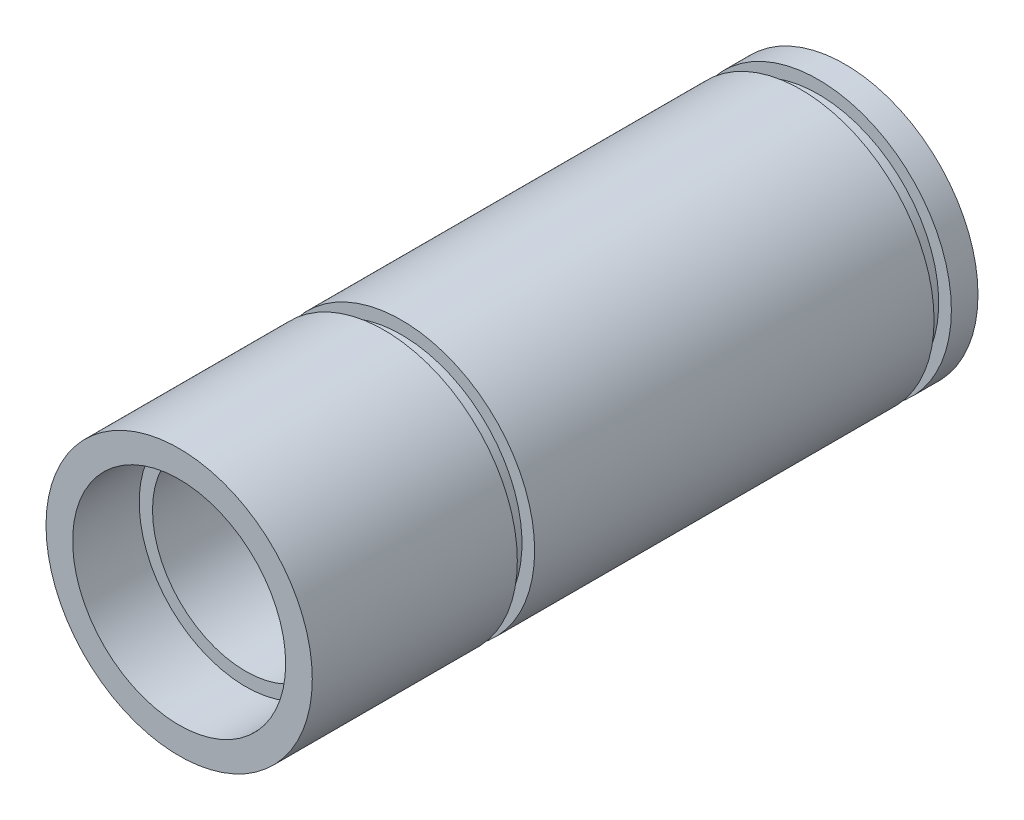
ISO-10303-21;
HEADER;
FILE_DESCRIPTION(('STEP AP214'),'2;1');
FILE_NAME('part.step','',(''),(''),'','','');
FILE_SCHEMA(('AUTOMOTIVE_DESIGN { 1 0 10303 214 1 1 1 1 }'));
ENDSEC;
DATA;
#1=APPLICATION_CONTEXT('core data for automotive mechanical design processes');
#2=APPLICATION_PROTOCOL_DEFINITION('international standard','automotive_design',2000,#1);
#3=PRODUCT_CONTEXT('',#1,'mechanical');
#4=PRODUCT('Part','Part','',(#3));
#5=PRODUCT_RELATED_PRODUCT_CATEGORY('part','',(#4));
#6=PRODUCT_DEFINITION_FORMATION('','',#4);
#7=PRODUCT_DEFINITION_CONTEXT('part definition',#1,'design');
#8=PRODUCT_DEFINITION('design','',#6,#7);
#9=PRODUCT_DEFINITION_SHAPE('','',#8);
#10=(LENGTH_UNIT() NAMED_UNIT(*) SI_UNIT(.MILLI.,.METRE.));
#11=(NAMED_UNIT(*) PLANE_ANGLE_UNIT() SI_UNIT($,.RADIAN.));
#12=(NAMED_UNIT(*) SI_UNIT($,.STERADIAN.) SOLID_ANGLE_UNIT());
#13=UNCERTAINTY_MEASURE_WITH_UNIT(LENGTH_MEASURE(1.E-05),#10,'distance_accuracy_value','');
#14=(GEOMETRIC_REPRESENTATION_CONTEXT(3) GLOBAL_UNCERTAINTY_ASSIGNED_CONTEXT((#13)) GLOBAL_UNIT_ASSIGNED_CONTEXT((#10,
#11,#12)) REPRESENTATION_CONTEXT('',''));
#15=CARTESIAN_POINT('',(0.,0.,0.));
#16=DIRECTION('',(0.,0.,1.));
#17=DIRECTION('',(1.,0.,0.));
#18=AXIS2_PLACEMENT_3D('',#15,#16,#17);
#19=CARTESIAN_POINT('',(0.,0.,50.));
#20=DIRECTION('',(0.,0.,-1.));
#21=DIRECTION('',(-1.,0.,0.));
#22=AXIS2_PLACEMENT_3D('',#19,#20,#21);
#23=CYLINDRICAL_SURFACE('',#22,10.);
#24=CARTESIAN_POINT('',(0.,0.,50.));
#25=DIRECTION('',(0.,0.,1.));
#26=DIRECTION('',(1.,0.,0.));
#27=AXIS2_PLACEMENT_3D('',#24,#25,#26);
#28=CIRCLE('',#27,10.);
#29=CARTESIAN_POINT('',(10.,0.,50.));
#30=VERTEX_POINT('',#29);
#31=EDGE_CURVE('E11',#30,#30,#28,.T.);
#32=ORIENTED_EDGE('',*,*,#31,.F.);
#33=EDGE_LOOP('',(#32));
#34=FACE_BOUND('',#33,.T.);
#35=CARTESIAN_POINT('',(0.,0.,34.6));
#36=DIRECTION('',(0.,0.,-1.));
#37=DIRECTION('',(-1.,0.,0.));
#38=AXIS2_PLACEMENT_3D('',#35,#36,#37);
#39=CIRCLE('',#38,10.);
#40=CARTESIAN_POINT('',(-10.,0.,34.6));
#41=VERTEX_POINT('',#40);
#42=EDGE_CURVE('E89',#41,#41,#39,.T.);
#43=ORIENTED_EDGE('',*,*,#42,.F.);
#44=EDGE_LOOP('',(#43));
#45=FACE_BOUND('',#44,.T.);
#46=ADVANCED_FACE('F46',(#34,#45),#23,.T.);
#47=CARTESIAN_POINT('',(0.,0.,33.3));
#48=DIRECTION('',(0.,0.,-1.));
#49=DIRECTION('',(-1.,0.,0.));
#50=AXIS2_PLACEMENT_3D('',#47,#48,#49);
#51=CIRCLE('',#50,10.);
#52=CARTESIAN_POINT('',(-10.,0.,33.3));
#53=VERTEX_POINT('',#52);
#54=EDGE_CURVE('E92',#53,#53,#51,.T.);
#55=ORIENTED_EDGE('',*,*,#54,.T.);
#56=EDGE_LOOP('',(#55));
#57=FACE_BOUND('',#56,.T.);
#58=CARTESIAN_POINT('',(0.,0.,3.3));
#59=DIRECTION('',(0.,0.,-1.));
#60=DIRECTION('',(-1.,0.,0.));
#61=AXIS2_PLACEMENT_3D('',#58,#59,#60);
#62=CIRCLE('',#61,9.99999999999997);
#63=CARTESIAN_POINT('',(-9.99999999999993,0.,3.3));
#64=VERTEX_POINT('',#63);
#65=EDGE_CURVE('E77',#64,#64,#62,.T.);
#66=ORIENTED_EDGE('',*,*,#65,.F.);
#67=EDGE_LOOP('',(#66));
#68=FACE_BOUND('',#67,.T.);
#69=ADVANCED_FACE('F116',(#57,#68),#23,.T.);
#70=CARTESIAN_POINT('',(0.,0.,50.));
#71=DIRECTION('',(0.,0.,-1.));
#72=DIRECTION('',(-1.,0.,0.));
#73=AXIS2_PLACEMENT_3D('',#70,#71,#72);
#74=CYLINDRICAL_SURFACE('',#73,7.);
#75=CARTESIAN_POINT('',(0.,0.,45.));
#76=DIRECTION('',(0.,0.,1.));
#77=DIRECTION('',(1.,0.,0.));
#78=AXIS2_PLACEMENT_3D('',#75,#76,#77);
#79=CIRCLE('',#78,7.);
#80=CARTESIAN_POINT('',(7.,0.,45.));
#81=VERTEX_POINT('',#80);
#82=EDGE_CURVE('E59',#81,#81,#79,.T.);
#83=ORIENTED_EDGE('',*,*,#82,.T.);
#84=EDGE_LOOP('',(#83));
#85=FACE_BOUND('',#84,.T.);
#86=CARTESIAN_POINT('',(0.,0.,5.));
#87=DIRECTION('',(0.,0.,-1.));
#88=DIRECTION('',(-1.,0.,0.));
#89=AXIS2_PLACEMENT_3D('',#86,#87,#88);
#90=CIRCLE('',#89,7.);
#91=CARTESIAN_POINT('',(-7.,0.,5.));
#92=VERTEX_POINT('',#91);
#93=EDGE_CURVE('E50',#92,#92,#90,.T.);
#94=ORIENTED_EDGE('',*,*,#93,.T.);
#95=EDGE_LOOP('',(#94));
#96=FACE_BOUND('',#95,.T.);
#97=ADVANCED_FACE('F122',(#85,#96),#74,.F.);
#98=CARTESIAN_POINT('',(0.,0.,50.));
#99=DIRECTION('',(0.,0.,1.));
#100=DIRECTION('',(1.,0.,0.));
#101=AXIS2_PLACEMENT_3D('',#98,#99,#100);
#102=PLANE('',#101);
#103=CARTESIAN_POINT('',(0.,0.,50.));
#104=DIRECTION('',(0.,0.,1.));
#105=DIRECTION('',(1.,0.,0.));
#106=AXIS2_PLACEMENT_3D('',#103,#104,#105);
#107=CIRCLE('',#106,8.);
#108=CARTESIAN_POINT('',(8.,0.,50.));
#109=VERTEX_POINT('',#108);
#110=EDGE_CURVE('E62',#109,#109,#107,.T.);
#111=ORIENTED_EDGE('',*,*,#110,.F.);
#112=EDGE_LOOP('',(#111));
#113=FACE_BOUND('',#112,.T.);
#114=ORIENTED_EDGE('',*,*,#31,.T.);
#115=EDGE_LOOP('',(#114));
#116=FACE_BOUND('',#115,.T.);
#117=ADVANCED_FACE('F137',(#113,#116),#102,.T.);
#118=CARTESIAN_POINT('',(0.,0.,0.));
#119=DIRECTION('',(0.,0.,1.));
#120=DIRECTION('',(1.,0.,0.));
#121=AXIS2_PLACEMENT_3D('',#118,#119,#120);
#122=PLANE('',#121);
#123=CARTESIAN_POINT('',(0.,0.,0.));
#124=DIRECTION('',(0.,0.,1.));
#125=DIRECTION('',(1.,0.,0.));
#126=AXIS2_PLACEMENT_3D('',#123,#124,#125);
#127=CIRCLE('',#126,8.);
#128=CARTESIAN_POINT('',(8.,0.,0.));
#129=VERTEX_POINT('',#128);
#130=EDGE_CURVE('E73',#129,#129,#127,.T.);
#131=ORIENTED_EDGE('',*,*,#130,.T.);
#132=EDGE_LOOP('',(#131));
#133=FACE_BOUND('',#132,.T.);
#134=CARTESIAN_POINT('',(0.,0.,0.));
#135=DIRECTION('',(0.,0.,1.));
#136=DIRECTION('',(1.,0.,0.));
#137=AXIS2_PLACEMENT_3D('',#134,#135,#136);
#138=CIRCLE('',#137,10.);
#139=CARTESIAN_POINT('',(10.,0.,0.));
#140=VERTEX_POINT('',#139);
#141=EDGE_CURVE('E54',#140,#140,#138,.T.);
#142=ORIENTED_EDGE('',*,*,#141,.F.);
#143=EDGE_LOOP('',(#142));
#144=FACE_BOUND('',#143,.T.);
#145=ADVANCED_FACE('F126',(#133,#144),#122,.F.);
#146=CARTESIAN_POINT('',(0.,0.,2.));
#147=DIRECTION('',(0.,0.,-1.));
#148=DIRECTION('',(-1.,0.,0.));
#149=AXIS2_PLACEMENT_3D('',#146,#147,#148);
#150=CIRCLE('',#149,9.99999999999997);
#151=CARTESIAN_POINT('',(-9.99999999999993,0.,2.));
#152=VERTEX_POINT('',#151);
#153=EDGE_CURVE('E80',#152,#152,#150,.T.);
#154=ORIENTED_EDGE('',*,*,#153,.T.);
#155=EDGE_LOOP('',(#154));
#156=FACE_BOUND('',#155,.T.);
#157=ORIENTED_EDGE('',*,*,#141,.T.);
#158=EDGE_LOOP('',(#157));
#159=FACE_BOUND('',#158,.T.);
#160=ADVANCED_FACE('F48',(#156,#159),#23,.T.);
#161=CARTESIAN_POINT('',(0.,0.,45.));
#162=DIRECTION('',(0.,0.,1.));
#163=DIRECTION('',(1.,0.,0.));
#164=AXIS2_PLACEMENT_3D('',#161,#162,#163);
#165=CYLINDRICAL_SURFACE('',#164,8.);
#166=CARTESIAN_POINT('',(0.,0.,45.));
#167=DIRECTION('',(0.,0.,1.));
#168=DIRECTION('',(1.,0.,0.));
#169=AXIS2_PLACEMENT_3D('',#166,#167,#168);
#170=CIRCLE('',#169,8.);
#171=CARTESIAN_POINT('',(8.,0.,45.));
#172=VERTEX_POINT('',#171);
#173=EDGE_CURVE('E65',#172,#172,#170,.T.);
#174=ORIENTED_EDGE('',*,*,#173,.F.);
#175=EDGE_LOOP('',(#174));
#176=FACE_BOUND('',#175,.T.);
#177=ORIENTED_EDGE('',*,*,#110,.T.);
#178=EDGE_LOOP('',(#177));
#179=FACE_BOUND('',#178,.T.);
#180=ADVANCED_FACE('F125',(#176,#179),#165,.F.);
#181=CARTESIAN_POINT('',(0.,0.,45.));
#182=DIRECTION('',(0.,0.,1.));
#183=DIRECTION('',(1.,0.,0.));
#184=AXIS2_PLACEMENT_3D('',#181,#182,#183);
#185=PLANE('',#184);
#186=ORIENTED_EDGE('',*,*,#82,.F.);
#187=EDGE_LOOP('',(#186));
#188=FACE_BOUND('',#187,.T.);
#189=ORIENTED_EDGE('',*,*,#173,.T.);
#190=EDGE_LOOP('',(#189));
#191=FACE_BOUND('',#190,.T.);
#192=ADVANCED_FACE('F133',(#188,#191),#185,.T.);
#193=CARTESIAN_POINT('',(0.,0.,5.));
#194=DIRECTION('',(0.,0.,-1.));
#195=DIRECTION('',(-1.,0.,0.));
#196=AXIS2_PLACEMENT_3D('',#193,#194,#195);
#197=CYLINDRICAL_SURFACE('',#196,8.);
#198=CARTESIAN_POINT('',(0.,0.,5.));
#199=DIRECTION('',(0.,0.,1.));
#200=DIRECTION('',(1.,0.,0.));
#201=AXIS2_PLACEMENT_3D('',#198,#199,#200);
#202=CIRCLE('',#201,8.);
#203=CARTESIAN_POINT('',(8.,0.,5.));
#204=VERTEX_POINT('',#203);
#205=EDGE_CURVE('E76',#204,#204,#202,.T.);
#206=ORIENTED_EDGE('',*,*,#205,.T.);
#207=EDGE_LOOP('',(#206));
#208=FACE_BOUND('',#207,.T.);
#209=ORIENTED_EDGE('',*,*,#130,.F.);
#210=EDGE_LOOP('',(#209));
#211=FACE_BOUND('',#210,.T.);
#212=ADVANCED_FACE('F161',(#208,#211),#197,.F.);
#213=CARTESIAN_POINT('',(0.,0.,5.));
#214=DIRECTION('',(0.,0.,-1.));
#215=DIRECTION('',(1.,0.,0.));
#216=AXIS2_PLACEMENT_3D('',#213,#214,#215);
#217=PLANE('',#216);
#218=ORIENTED_EDGE('',*,*,#93,.F.);
#219=EDGE_LOOP('',(#218));
#220=FACE_BOUND('',#219,.T.);
#221=ORIENTED_EDGE('',*,*,#205,.F.);
#222=EDGE_LOOP('',(#221));
#223=FACE_BOUND('',#222,.T.);
#224=ADVANCED_FACE('F155',(#220,#223),#217,.T.);
#225=CARTESIAN_POINT('',(0.,0.,3.3));
#226=DIRECTION('',(0.,0.,-1.));
#227=DIRECTION('',(-1.,0.,0.));
#228=AXIS2_PLACEMENT_3D('',#225,#226,#227);
#229=PLANE('',#228);
#230=CARTESIAN_POINT('',(0.,0.,3.3));
#231=DIRECTION('',(0.,0.,-1.));
#232=DIRECTION('',(-1.,0.,0.));
#233=AXIS2_PLACEMENT_3D('',#230,#231,#232);
#234=CIRCLE('',#233,9.05);
#235=CARTESIAN_POINT('',(-9.04999999999997,0.,3.3));
#236=VERTEX_POINT('',#235);
#237=EDGE_CURVE('E83',#236,#236,#234,.T.);
#238=ORIENTED_EDGE('',*,*,#237,.F.);
#239=EDGE_LOOP('',(#238));
#240=FACE_BOUND('',#239,.T.);
#241=ORIENTED_EDGE('',*,*,#65,.T.);
#242=EDGE_LOOP('',(#241));
#243=FACE_BOUND('',#242,.T.);
#244=ADVANCED_FACE('F146',(#240,#243),#229,.T.);
#245=CARTESIAN_POINT('',(0.,0.,2.));
#246=DIRECTION('',(0.,0.,-1.));
#247=DIRECTION('',(-1.,0.,0.));
#248=AXIS2_PLACEMENT_3D('',#245,#246,#247);
#249=PLANE('',#248);
#250=CARTESIAN_POINT('',(0.,0.,2.));
#251=DIRECTION('',(0.,0.,-1.));
#252=DIRECTION('',(-1.,0.,0.));
#253=AXIS2_PLACEMENT_3D('',#250,#251,#252);
#254=CIRCLE('',#253,9.05);
#255=CARTESIAN_POINT('',(-9.04999999999997,0.,2.));
#256=VERTEX_POINT('',#255);
#257=EDGE_CURVE('E86',#256,#256,#254,.T.);
#258=ORIENTED_EDGE('',*,*,#257,.T.);
#259=EDGE_LOOP('',(#258));
#260=FACE_BOUND('',#259,.T.);
#261=ORIENTED_EDGE('',*,*,#153,.F.);
#262=EDGE_LOOP('',(#261));
#263=FACE_BOUND('',#262,.T.);
#264=ADVANCED_FACE('F144',(#260,#263),#249,.F.);
#265=CARTESIAN_POINT('',(0.,0.,3.3));
#266=DIRECTION('',(0.,0.,-1.));
#267=DIRECTION('',(-1.,0.,0.));
#268=AXIS2_PLACEMENT_3D('',#265,#266,#267);
#269=CYLINDRICAL_SURFACE('',#268,9.05);
#270=ORIENTED_EDGE('',*,*,#237,.T.);
#271=EDGE_LOOP('',(#270));
#272=FACE_BOUND('',#271,.T.);
#273=ORIENTED_EDGE('',*,*,#257,.F.);
#274=EDGE_LOOP('',(#273));
#275=FACE_BOUND('',#274,.T.);
#276=ADVANCED_FACE('F111',(#272,#275),#269,.T.);
#277=CARTESIAN_POINT('',(0.,0.,34.6));
#278=DIRECTION('',(0.,0.,-1.));
#279=DIRECTION('',(-1.,0.,0.));
#280=AXIS2_PLACEMENT_3D('',#277,#278,#279);
#281=PLANE('',#280);
#282=CARTESIAN_POINT('',(0.,0.,34.6));
#283=DIRECTION('',(0.,0.,-1.));
#284=DIRECTION('',(-1.,0.,0.));
#285=AXIS2_PLACEMENT_3D('',#282,#283,#284);
#286=CIRCLE('',#285,9.05);
#287=CARTESIAN_POINT('',(-9.05,0.,34.6));
#288=VERTEX_POINT('',#287);
#289=EDGE_CURVE('E95',#288,#288,#286,.T.);
#290=ORIENTED_EDGE('',*,*,#289,.F.);
#291=EDGE_LOOP('',(#290));
#292=FACE_BOUND('',#291,.T.);
#293=ORIENTED_EDGE('',*,*,#42,.T.);
#294=EDGE_LOOP('',(#293));
#295=FACE_BOUND('',#294,.T.);
#296=ADVANCED_FACE('F107',(#292,#295),#281,.T.);
#297=CARTESIAN_POINT('',(0.,0.,33.3));
#298=DIRECTION('',(0.,0.,-1.));
#299=DIRECTION('',(-1.,0.,0.));
#300=AXIS2_PLACEMENT_3D('',#297,#298,#299);
#301=PLANE('',#300);
#302=CARTESIAN_POINT('',(0.,0.,33.3));
#303=DIRECTION('',(0.,0.,-1.));
#304=DIRECTION('',(-1.,0.,0.));
#305=AXIS2_PLACEMENT_3D('',#302,#303,#304);
#306=CIRCLE('',#305,9.05);
#307=CARTESIAN_POINT('',(-9.05,0.,33.3));
#308=VERTEX_POINT('',#307);
#309=EDGE_CURVE('E98',#308,#308,#306,.T.);
#310=ORIENTED_EDGE('',*,*,#309,.T.);
#311=EDGE_LOOP('',(#310));
#312=FACE_BOUND('',#311,.T.);
#313=ORIENTED_EDGE('',*,*,#54,.F.);
#314=EDGE_LOOP('',(#313));
#315=FACE_BOUND('',#314,.T.);
#316=ADVANCED_FACE('F110',(#312,#315),#301,.F.);
#317=CARTESIAN_POINT('',(0.,0.,34.6));
#318=DIRECTION('',(0.,0.,-1.));
#319=DIRECTION('',(-1.,0.,0.));
#320=AXIS2_PLACEMENT_3D('',#317,#318,#319);
#321=CYLINDRICAL_SURFACE('',#320,9.05);
#322=ORIENTED_EDGE('',*,*,#289,.T.);
#323=EDGE_LOOP('',(#322));
#324=FACE_BOUND('',#323,.T.);
#325=ORIENTED_EDGE('',*,*,#309,.F.);
#326=EDGE_LOOP('',(#325));
#327=FACE_BOUND('',#326,.T.);
#328=ADVANCED_FACE('F104',(#324,#327),#321,.T.);
#329=CLOSED_SHELL('',(#46,#69,#97,#117,#145,#160,#180,#192,#212,#224,#244,#264,#276,#296,#316,#328));
#330=MANIFOLD_SOLID_BREP('B2',#329);
#331=ADVANCED_BREP_SHAPE_REPRESENTATION('',(#18,#330),#14);
#332=SHAPE_DEFINITION_REPRESENTATION(#9,#331);
ENDSEC;
END-ISO-10303-21;
